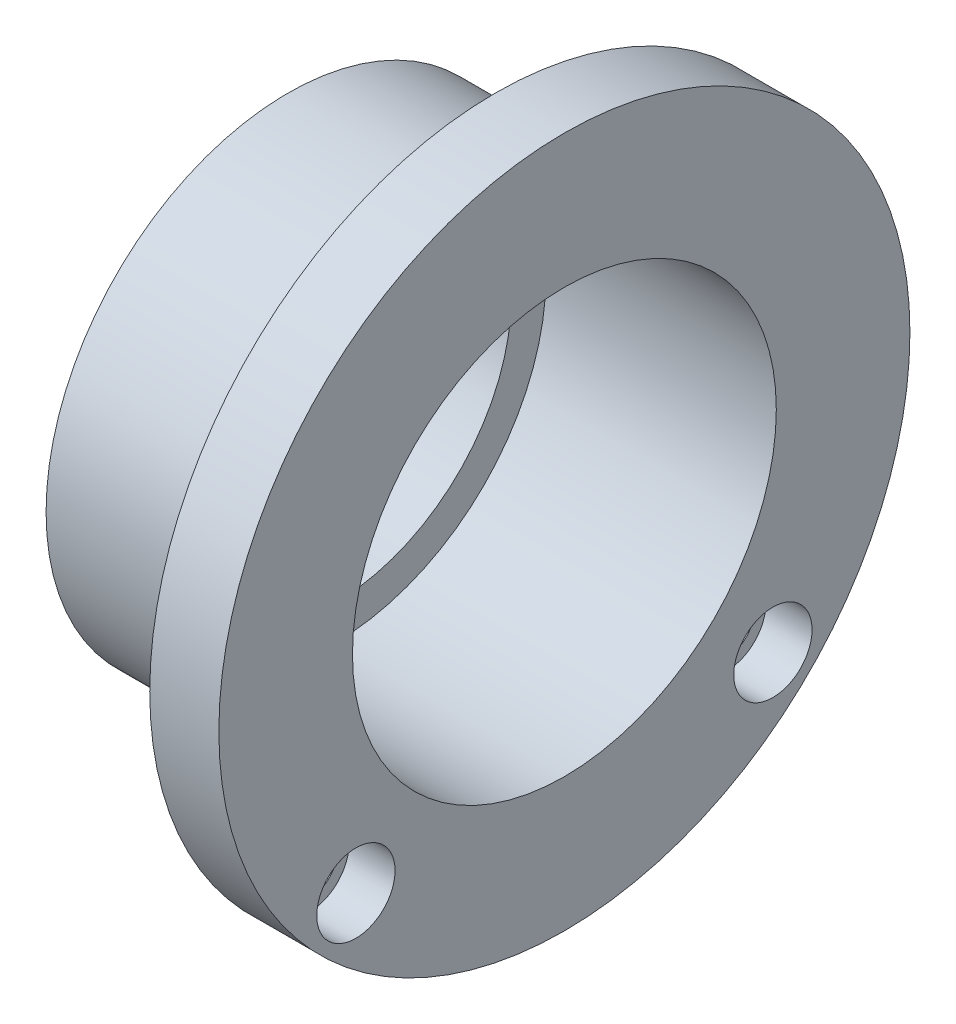
ISO-10303-21;
HEADER;
FILE_DESCRIPTION(('STEP AP214'),'2;1');
FILE_NAME('part.step','',(''),(''),'','','');
FILE_SCHEMA(('AUTOMOTIVE_DESIGN { 1 0 10303 214 1 1 1 1 }'));
ENDSEC;
DATA;
#1=APPLICATION_CONTEXT('core data for automotive mechanical design processes');
#2=APPLICATION_PROTOCOL_DEFINITION('international standard','automotive_design',2000,#1);
#3=PRODUCT_CONTEXT('',#1,'mechanical');
#4=PRODUCT('Part','Part','',(#3));
#5=PRODUCT_RELATED_PRODUCT_CATEGORY('part','',(#4));
#6=PRODUCT_DEFINITION_FORMATION('','',#4);
#7=PRODUCT_DEFINITION_CONTEXT('part definition',#1,'design');
#8=PRODUCT_DEFINITION('design','',#6,#7);
#9=PRODUCT_DEFINITION_SHAPE('','',#8);
#10=(LENGTH_UNIT() NAMED_UNIT(*) SI_UNIT(.MILLI.,.METRE.));
#11=(NAMED_UNIT(*) PLANE_ANGLE_UNIT() SI_UNIT($,.RADIAN.));
#12=(NAMED_UNIT(*) SI_UNIT($,.STERADIAN.) SOLID_ANGLE_UNIT());
#13=UNCERTAINTY_MEASURE_WITH_UNIT(LENGTH_MEASURE(1.E-05),#10,'distance_accuracy_value','');
#14=(GEOMETRIC_REPRESENTATION_CONTEXT(3) GLOBAL_UNCERTAINTY_ASSIGNED_CONTEXT((#13)) GLOBAL_UNIT_ASSIGNED_CONTEXT((#10,
#11,#12)) REPRESENTATION_CONTEXT('',''));
#15=CARTESIAN_POINT('',(0.,0.,0.));
#16=DIRECTION('',(0.,0.,1.));
#17=DIRECTION('',(1.,0.,0.));
#18=AXIS2_PLACEMENT_3D('',#15,#16,#17);
#19=CARTESIAN_POINT('',(-56.1582278481012,-100.13141627442,45.2548339959391));
#20=DIRECTION('',(1.,0.,0.));
#21=DIRECTION('',(0.,0.,-1.));
#22=AXIS2_PLACEMENT_3D('',#19,#20,#21);
#23=CYLINDRICAL_SURFACE('',#22,6.);
#24=CARTESIAN_POINT('',(-55.1582278481012,-100.13141627442,45.2548339959391));
#25=DIRECTION('',(-1.,0.,0.));
#26=DIRECTION('',(0.,0.,1.));
#27=AXIS2_PLACEMENT_3D('',#24,#25,#26);
#28=CIRCLE('',#27,6.);
#29=CARTESIAN_POINT('',(-55.1582278481012,-100.13141627442,51.2548339959391));
#30=VERTEX_POINT('',#29);
#31=EDGE_CURVE('E52',#30,#30,#28,.T.);
#32=ORIENTED_EDGE('',*,*,#31,.T.);
#33=EDGE_LOOP('',(#32));
#34=FACE_BOUND('',#33,.T.);
#35=CARTESIAN_POINT('',(-50.1582278481012,-100.13141627442,45.2548339959391));
#36=DIRECTION('',(1.,0.,0.));
#37=DIRECTION('',(0.,0.,-1.));
#38=AXIS2_PLACEMENT_3D('',#35,#36,#37);
#39=CIRCLE('',#38,6.);
#40=CARTESIAN_POINT('',(-50.1582278481012,-100.13141627442,39.2548339959391));
#41=VERTEX_POINT('',#40);
#42=EDGE_CURVE('E39',#41,#41,#39,.F.);
#43=ORIENTED_EDGE('',*,*,#42,.F.);
#44=EDGE_LOOP('',(#43));
#45=FACE_BOUND('',#44,.T.);
#46=ADVANCED_FACE('F35',(#34,#45),#23,.F.);
#47=CARTESIAN_POINT('',(-56.1582278481012,-100.13141627442,-45.2548339959391));
#48=DIRECTION('',(1.,0.,0.));
#49=DIRECTION('',(0.,0.,-1.));
#50=AXIS2_PLACEMENT_3D('',#47,#48,#49);
#51=CYLINDRICAL_SURFACE('',#50,6.);
#52=CARTESIAN_POINT('',(-55.1582278481012,-100.13141627442,-45.2548339959391));
#53=DIRECTION('',(-1.,0.,0.));
#54=DIRECTION('',(0.,0.,1.));
#55=AXIS2_PLACEMENT_3D('',#52,#53,#54);
#56=CIRCLE('',#55,6.);
#57=CARTESIAN_POINT('',(-55.1582278481012,-100.13141627442,-39.2548339959391));
#58=VERTEX_POINT('',#57);
#59=EDGE_CURVE('E55',#58,#58,#56,.T.);
#60=ORIENTED_EDGE('',*,*,#59,.T.);
#61=EDGE_LOOP('',(#60));
#62=FACE_BOUND('',#61,.T.);
#63=CARTESIAN_POINT('',(-50.1582278481012,-100.13141627442,-45.2548339959391));
#64=DIRECTION('',(1.,0.,0.));
#65=DIRECTION('',(0.,0.,-1.));
#66=AXIS2_PLACEMENT_3D('',#63,#64,#65);
#67=CIRCLE('',#66,6.);
#68=CARTESIAN_POINT('',(-50.1582278481012,-100.13141627442,-51.2548339959391));
#69=VERTEX_POINT('',#68);
#70=EDGE_CURVE('E58',#69,#69,#67,.F.);
#71=ORIENTED_EDGE('',*,*,#70,.F.);
#72=EDGE_LOOP('',(#71));
#73=FACE_BOUND('',#72,.T.);
#74=ADVANCED_FACE('F110',(#62,#73),#51,.F.);
#75=CARTESIAN_POINT('',(-100.158227848101,-54.876582278481,0.));
#76=DIRECTION('',(-1.,0.,0.));
#77=DIRECTION('',(0.,0.,1.));
#78=AXIS2_PLACEMENT_3D('',#75,#76,#77);
#79=CYLINDRICAL_SURFACE('',#78,38.5);
#80=CARTESIAN_POINT('',(-100.158227848101,-54.876582278481,0.));
#81=DIRECTION('',(-1.,0.,0.));
#82=DIRECTION('',(0.,0.,1.));
#83=AXIS2_PLACEMENT_3D('',#80,#81,#82);
#84=CIRCLE('',#83,38.5);
#85=CARTESIAN_POINT('',(-100.158227848101,-54.876582278481,38.5));
#86=VERTEX_POINT('',#85);
#87=EDGE_CURVE('E57',#86,#86,#84,.T.);
#88=ORIENTED_EDGE('',*,*,#87,.T.);
#89=EDGE_LOOP('',(#88));
#90=FACE_BOUND('',#89,.T.);
#91=CARTESIAN_POINT('',(-90.1582278481012,-54.876582278481,0.));
#92=DIRECTION('',(-1.,0.,0.));
#93=DIRECTION('',(0.,0.,1.));
#94=AXIS2_PLACEMENT_3D('',#91,#92,#93);
#95=CIRCLE('',#94,38.5);
#96=CARTESIAN_POINT('',(-90.1582278481012,-54.876582278481,38.5));
#97=VERTEX_POINT('',#96);
#98=EDGE_CURVE('E10',#97,#97,#95,.T.);
#99=ORIENTED_EDGE('',*,*,#98,.F.);
#100=EDGE_LOOP('',(#99));
#101=FACE_BOUND('',#100,.T.);
#102=ADVANCED_FACE('F37',(#90,#101),#79,.F.);
#103=CARTESIAN_POINT('',(-90.1582278481012,0.,0.));
#104=DIRECTION('',(1.,0.,0.));
#105=DIRECTION('',(0.,0.,-1.));
#106=AXIS2_PLACEMENT_3D('',#103,#104,#105);
#107=PLANE('',#106);
#108=ORIENTED_EDGE('',*,*,#98,.T.);
#109=EDGE_LOOP('',(#108));
#110=FACE_BOUND('',#109,.T.);
#111=CARTESIAN_POINT('',(-90.1582278481012,-54.876582278481,0.));
#112=DIRECTION('',(-1.,0.,0.));
#113=DIRECTION('',(0.,0.,1.));
#114=AXIS2_PLACEMENT_3D('',#111,#112,#113);
#115=CIRCLE('',#114,46.);
#116=CARTESIAN_POINT('',(-90.1582278481012,-54.876582278481,46.));
#117=VERTEX_POINT('',#116);
#118=EDGE_CURVE('E43',#117,#117,#115,.T.);
#119=ORIENTED_EDGE('',*,*,#118,.F.);
#120=EDGE_LOOP('',(#119));
#121=FACE_BOUND('',#120,.T.);
#122=ADVANCED_FACE('F99',(#110,#121),#107,.T.);
#123=CARTESIAN_POINT('',(-100.158227848101,-54.876582278481,0.));
#124=DIRECTION('',(-1.,0.,0.));
#125=DIRECTION('',(0.,0.,1.));
#126=AXIS2_PLACEMENT_3D('',#123,#124,#125);
#127=CYLINDRICAL_SURFACE('',#126,46.);
#128=ORIENTED_EDGE('',*,*,#118,.T.);
#129=EDGE_LOOP('',(#128));
#130=FACE_BOUND('',#129,.T.);
#131=CARTESIAN_POINT('',(-40.1582278481012,-54.876582278481,0.));
#132=DIRECTION('',(-1.,0.,0.));
#133=DIRECTION('',(0.,0.,1.));
#134=AXIS2_PLACEMENT_3D('',#131,#132,#133);
#135=CIRCLE('',#134,46.);
#136=CARTESIAN_POINT('',(-40.1582278481012,-54.876582278481,46.));
#137=VERTEX_POINT('',#136);
#138=EDGE_CURVE('E48',#137,#137,#135,.T.);
#139=ORIENTED_EDGE('',*,*,#138,.F.);
#140=EDGE_LOOP('',(#139));
#141=FACE_BOUND('',#140,.T.);
#142=ADVANCED_FACE('F97',(#130,#141),#127,.F.);
#143=CARTESIAN_POINT('',(-40.1582278481012,0.,0.));
#144=DIRECTION('',(1.,0.,0.));
#145=DIRECTION('',(0.,0.,-1.));
#146=AXIS2_PLACEMENT_3D('',#143,#144,#145);
#147=PLANE('',#146);
#148=CARTESIAN_POINT('',(-40.1582278481012,-100.13141627442,45.2548339959391));
#149=DIRECTION('',(1.,0.,0.));
#150=DIRECTION('',(0.,0.,-1.));
#151=AXIS2_PLACEMENT_3D('',#148,#149,#150);
#152=CIRCLE('',#151,8.5);
#153=CARTESIAN_POINT('',(-40.1582278481012,-100.13141627442,36.7548339959391));
#154=VERTEX_POINT('',#153);
#155=EDGE_CURVE('E65',#154,#154,#152,.T.);
#156=ORIENTED_EDGE('',*,*,#155,.F.);
#157=EDGE_LOOP('',(#156));
#158=FACE_BOUND('',#157,.T.);
#159=CARTESIAN_POINT('',(-40.1582278481012,-100.13141627442,-45.2548339959391));
#160=DIRECTION('',(1.,0.,0.));
#161=DIRECTION('',(0.,0.,-1.));
#162=AXIS2_PLACEMENT_3D('',#159,#160,#161);
#163=CIRCLE('',#162,8.5);
#164=CARTESIAN_POINT('',(-40.1582278481012,-100.13141627442,-53.7548339959391));
#165=VERTEX_POINT('',#164);
#166=EDGE_CURVE('E75',#165,#165,#163,.T.);
#167=ORIENTED_EDGE('',*,*,#166,.F.);
#168=EDGE_LOOP('',(#167));
#169=FACE_BOUND('',#168,.T.);
#170=ORIENTED_EDGE('',*,*,#138,.T.);
#171=EDGE_LOOP('',(#170));
#172=FACE_BOUND('',#171,.T.);
#173=CARTESIAN_POINT('',(-40.1582278481013,-54.876582278481,0.));
#174=DIRECTION('',(-1.,0.,0.));
#175=DIRECTION('',(0.,0.,1.));
#176=AXIS2_PLACEMENT_3D('',#173,#174,#175);
#177=CIRCLE('',#176,75.);
#178=CARTESIAN_POINT('',(-40.1582278481013,-54.876582278481,75.));
#179=VERTEX_POINT('',#178);
#180=EDGE_CURVE('E89',#179,#179,#177,.T.);
#181=ORIENTED_EDGE('',*,*,#180,.F.);
#182=EDGE_LOOP('',(#181));
#183=FACE_BOUND('',#182,.T.);
#184=ADVANCED_FACE('F94',(#158,#169,#172,#183),#147,.T.);
#185=CARTESIAN_POINT('',(-100.158227848101,-54.876582278481,0.));
#186=DIRECTION('',(-1.,0.,0.));
#187=DIRECTION('',(0.,0.,1.));
#188=AXIS2_PLACEMENT_3D('',#185,#186,#187);
#189=CYLINDRICAL_SURFACE('',#188,75.);
#190=ORIENTED_EDGE('',*,*,#180,.T.);
#191=EDGE_LOOP('',(#190));
#192=FACE_BOUND('',#191,.T.);
#193=CARTESIAN_POINT('',(-55.1582278481012,-54.876582278481,0.));
#194=DIRECTION('',(-1.,0.,0.));
#195=DIRECTION('',(0.,0.,1.));
#196=AXIS2_PLACEMENT_3D('',#193,#194,#195);
#197=CIRCLE('',#196,75.);
#198=CARTESIAN_POINT('',(-55.1582278481012,-54.876582278481,75.));
#199=VERTEX_POINT('',#198);
#200=EDGE_CURVE('E86',#199,#199,#197,.T.);
#201=ORIENTED_EDGE('',*,*,#200,.F.);
#202=EDGE_LOOP('',(#201));
#203=FACE_BOUND('',#202,.T.);
#204=ADVANCED_FACE('F106',(#192,#203),#189,.T.);
#205=CARTESIAN_POINT('',(-55.1582278481012,0.,0.));
#206=DIRECTION('',(-1.,0.,0.));
#207=DIRECTION('',(0.,0.,1.));
#208=AXIS2_PLACEMENT_3D('',#205,#206,#207);
#209=PLANE('',#208);
#210=ORIENTED_EDGE('',*,*,#59,.F.);
#211=EDGE_LOOP('',(#210));
#212=FACE_BOUND('',#211,.T.);
#213=ORIENTED_EDGE('',*,*,#31,.F.);
#214=EDGE_LOOP('',(#213));
#215=FACE_BOUND('',#214,.T.);
#216=ORIENTED_EDGE('',*,*,#200,.T.);
#217=EDGE_LOOP('',(#216));
#218=FACE_BOUND('',#217,.T.);
#219=CARTESIAN_POINT('',(-55.1582278481012,-54.876582278481,0.));
#220=DIRECTION('',(-1.,0.,0.));
#221=DIRECTION('',(0.,0.,1.));
#222=AXIS2_PLACEMENT_3D('',#219,#220,#221);
#223=CIRCLE('',#222,52.5);
#224=CARTESIAN_POINT('',(-55.1582278481012,-54.876582278481,52.5));
#225=VERTEX_POINT('',#224);
#226=EDGE_CURVE('E83',#225,#225,#223,.T.);
#227=ORIENTED_EDGE('',*,*,#226,.F.);
#228=EDGE_LOOP('',(#227));
#229=FACE_BOUND('',#228,.T.);
#230=ADVANCED_FACE('F129',(#212,#215,#218,#229),#209,.T.);
#231=CARTESIAN_POINT('',(-100.158227848101,-54.876582278481,0.));
#232=DIRECTION('',(-1.,0.,0.));
#233=DIRECTION('',(0.,0.,1.));
#234=AXIS2_PLACEMENT_3D('',#231,#232,#233);
#235=CYLINDRICAL_SURFACE('',#234,52.5);
#236=ORIENTED_EDGE('',*,*,#226,.T.);
#237=EDGE_LOOP('',(#236));
#238=FACE_BOUND('',#237,.T.);
#239=CARTESIAN_POINT('',(-100.158227848101,-54.876582278481,0.));
#240=DIRECTION('',(-1.,0.,0.));
#241=DIRECTION('',(0.,0.,1.));
#242=AXIS2_PLACEMENT_3D('',#239,#240,#241);
#243=CIRCLE('',#242,52.5);
#244=CARTESIAN_POINT('',(-100.158227848101,-54.876582278481,52.5));
#245=VERTEX_POINT('',#244);
#246=EDGE_CURVE('E80',#245,#245,#243,.T.);
#247=ORIENTED_EDGE('',*,*,#246,.F.);
#248=EDGE_LOOP('',(#247));
#249=FACE_BOUND('',#248,.T.);
#250=ADVANCED_FACE('F125',(#238,#249),#235,.T.);
#251=CARTESIAN_POINT('',(-100.158227848101,0.,0.));
#252=DIRECTION('',(-1.,0.,0.));
#253=DIRECTION('',(0.,0.,1.));
#254=AXIS2_PLACEMENT_3D('',#251,#252,#253);
#255=PLANE('',#254);
#256=ORIENTED_EDGE('',*,*,#246,.T.);
#257=EDGE_LOOP('',(#256));
#258=FACE_BOUND('',#257,.T.);
#259=ORIENTED_EDGE('',*,*,#87,.F.);
#260=EDGE_LOOP('',(#259));
#261=FACE_BOUND('',#260,.T.);
#262=ADVANCED_FACE('F121',(#258,#261),#255,.T.);
#263=CARTESIAN_POINT('',(-50.1582278481012,-100.13141627442,-45.2548339959391));
#264=DIRECTION('',(1.,0.,0.));
#265=DIRECTION('',(0.,0.,-1.));
#266=AXIS2_PLACEMENT_3D('',#263,#264,#265);
#267=PLANE('',#266);
#268=CARTESIAN_POINT('',(-50.1582278481012,-100.13141627442,-45.2548339959391));
#269=DIRECTION('',(1.,0.,0.));
#270=DIRECTION('',(0.,0.,-1.));
#271=AXIS2_PLACEMENT_3D('',#268,#269,#270);
#272=CIRCLE('',#271,8.5);
#273=CARTESIAN_POINT('',(-50.1582278481012,-100.13141627442,-53.7548339959391));
#274=VERTEX_POINT('',#273);
#275=EDGE_CURVE('E70',#274,#274,#272,.T.);
#276=ORIENTED_EDGE('',*,*,#275,.T.);
#277=EDGE_LOOP('',(#276));
#278=FACE_BOUND('',#277,.T.);
#279=ORIENTED_EDGE('',*,*,#70,.T.);
#280=EDGE_LOOP('',(#279));
#281=FACE_BOUND('',#280,.T.);
#282=ADVANCED_FACE('F124',(#278,#281),#267,.T.);
#283=CARTESIAN_POINT('',(-50.1582278481012,-100.13141627442,-45.2548339959391));
#284=DIRECTION('',(1.,0.,0.));
#285=DIRECTION('',(0.,0.,-1.));
#286=AXIS2_PLACEMENT_3D('',#283,#284,#285);
#287=CYLINDRICAL_SURFACE('',#286,8.5);
#288=ORIENTED_EDGE('',*,*,#275,.F.);
#289=EDGE_LOOP('',(#288));
#290=FACE_BOUND('',#289,.T.);
#291=ORIENTED_EDGE('',*,*,#166,.T.);
#292=EDGE_LOOP('',(#291));
#293=FACE_BOUND('',#292,.T.);
#294=ADVANCED_FACE('F208',(#290,#293),#287,.F.);
#295=CARTESIAN_POINT('',(-50.1582278481012,-100.13141627442,45.2548339959391));
#296=DIRECTION('',(1.,0.,0.));
#297=DIRECTION('',(0.,0.,-1.));
#298=AXIS2_PLACEMENT_3D('',#295,#296,#297);
#299=PLANE('',#298);
#300=CARTESIAN_POINT('',(-50.1582278481012,-100.13141627442,45.2548339959391));
#301=DIRECTION('',(1.,0.,0.));
#302=DIRECTION('',(0.,0.,-1.));
#303=AXIS2_PLACEMENT_3D('',#300,#301,#302);
#304=CIRCLE('',#303,8.5);
#305=CARTESIAN_POINT('',(-50.1582278481012,-100.13141627442,36.7548339959391));
#306=VERTEX_POINT('',#305);
#307=EDGE_CURVE('E60',#306,#306,#304,.T.);
#308=ORIENTED_EDGE('',*,*,#307,.T.);
#309=EDGE_LOOP('',(#308));
#310=FACE_BOUND('',#309,.T.);
#311=ORIENTED_EDGE('',*,*,#42,.T.);
#312=EDGE_LOOP('',(#311));
#313=FACE_BOUND('',#312,.T.);
#314=ADVANCED_FACE('F218',(#310,#313),#299,.T.);
#315=CARTESIAN_POINT('',(-50.1582278481012,-100.13141627442,45.2548339959391));
#316=DIRECTION('',(1.,0.,0.));
#317=DIRECTION('',(0.,0.,-1.));
#318=AXIS2_PLACEMENT_3D('',#315,#316,#317);
#319=CYLINDRICAL_SURFACE('',#318,8.5);
#320=ORIENTED_EDGE('',*,*,#307,.F.);
#321=EDGE_LOOP('',(#320));
#322=FACE_BOUND('',#321,.T.);
#323=ORIENTED_EDGE('',*,*,#155,.T.);
#324=EDGE_LOOP('',(#323));
#325=FACE_BOUND('',#324,.T.);
#326=ADVANCED_FACE('F227',(#322,#325),#319,.F.);
#327=CLOSED_SHELL('',(#46,#74,#102,#122,#142,#184,#204,#230,#250,#262,#282,#294,#314,#326));
#328=MANIFOLD_SOLID_BREP('B2',#327);
#329=ADVANCED_BREP_SHAPE_REPRESENTATION('',(#18,#328),#14);
#330=SHAPE_DEFINITION_REPRESENTATION(#9,#329);
ENDSEC;
END-ISO-10303-21;
